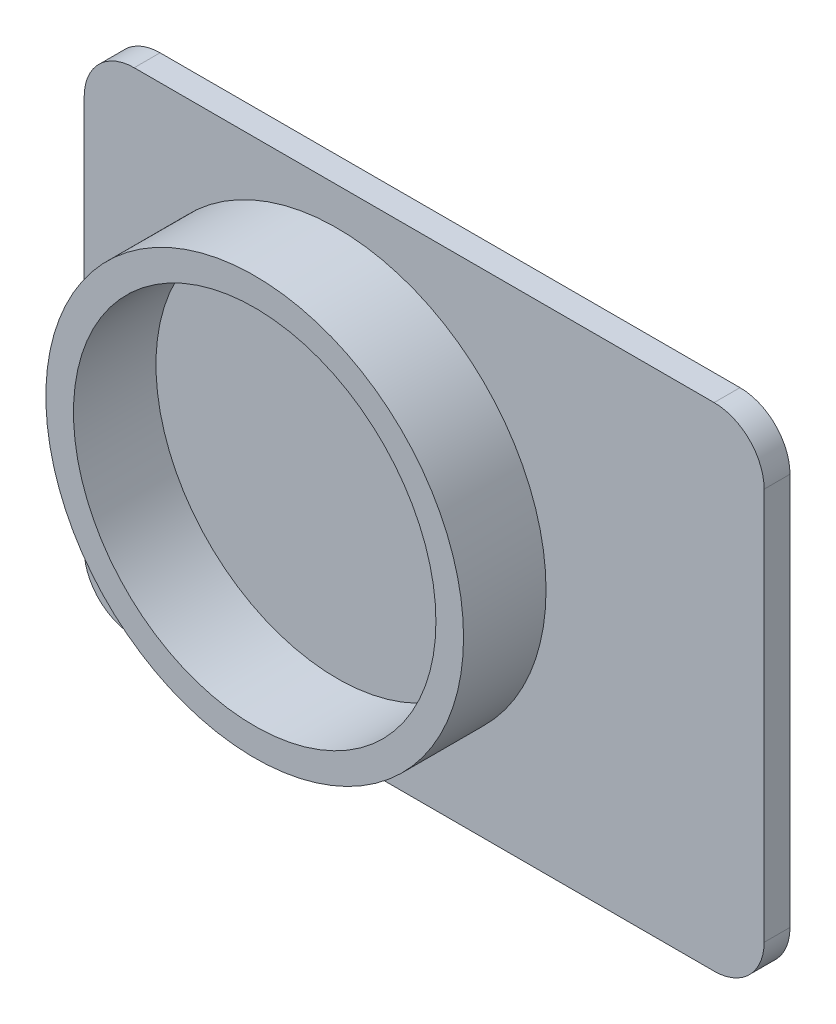
ISO-10303-21;
HEADER;
FILE_DESCRIPTION(('STEP AP214'),'2;1');
FILE_NAME('part.step','',(''),(''),'','','');
FILE_SCHEMA(('AUTOMOTIVE_DESIGN { 1 0 10303 214 1 1 1 1 }'));
ENDSEC;
DATA;
#1=APPLICATION_CONTEXT('core data for automotive mechanical design processes');
#2=APPLICATION_PROTOCOL_DEFINITION('international standard','automotive_design',2000,#1);
#3=PRODUCT_CONTEXT('',#1,'mechanical');
#4=PRODUCT('Part','Part','',(#3));
#5=PRODUCT_RELATED_PRODUCT_CATEGORY('part','',(#4));
#6=PRODUCT_DEFINITION_FORMATION('','',#4);
#7=PRODUCT_DEFINITION_CONTEXT('part definition',#1,'design');
#8=PRODUCT_DEFINITION('design','',#6,#7);
#9=PRODUCT_DEFINITION_SHAPE('','',#8);
#10=(LENGTH_UNIT() NAMED_UNIT(*) SI_UNIT(.MILLI.,.METRE.));
#11=(NAMED_UNIT(*) PLANE_ANGLE_UNIT() SI_UNIT($,.RADIAN.));
#12=(NAMED_UNIT(*) SI_UNIT($,.STERADIAN.) SOLID_ANGLE_UNIT());
#13=UNCERTAINTY_MEASURE_WITH_UNIT(LENGTH_MEASURE(1.E-05),#10,'distance_accuracy_value','');
#14=(GEOMETRIC_REPRESENTATION_CONTEXT(3) GLOBAL_UNCERTAINTY_ASSIGNED_CONTEXT((#13)) GLOBAL_UNIT_ASSIGNED_CONTEXT((#10,
#11,#12)) REPRESENTATION_CONTEXT('',''));
#15=CARTESIAN_POINT('',(0.,0.,0.));
#16=DIRECTION('',(0.,0.,1.));
#17=DIRECTION('',(1.,0.,0.));
#18=AXIS2_PLACEMENT_3D('',#15,#16,#17);
#19=CARTESIAN_POINT('',(-23.2,15.7,2.07));
#20=DIRECTION('',(0.,0.,-1.));
#21=DIRECTION('',(-1.,0.,0.));
#22=AXIS2_PLACEMENT_3D('',#19,#20,#21);
#23=CYLINDRICAL_SURFACE('',#22,4.00000000000001);
#24=CARTESIAN_POINT('',(-23.2,15.7,0.));
#25=DIRECTION('',(0.,0.,1.));
#26=DIRECTION('',(1.,0.,0.));
#27=AXIS2_PLACEMENT_3D('',#24,#25,#26);
#28=CIRCLE('',#27,4.00000000000001);
#29=CARTESIAN_POINT('',(-23.2,19.7,0.));
#30=VERTEX_POINT('',#29);
#31=CARTESIAN_POINT('',(-27.2,15.7,0.));
#32=VERTEX_POINT('',#31);
#33=EDGE_CURVE('E154',#30,#32,#28,.T.);
#34=ORIENTED_EDGE('',*,*,#33,.T.);
#35=DIRECTION('',(0.,0.,-1.));
#36=VECTOR('',#35,1.);
#37=CARTESIAN_POINT('',(-27.2,15.7,2.07));
#38=LINE('',#37,#36);
#39=CARTESIAN_POINT('',(-27.2,15.7,2.07));
#40=VERTEX_POINT('',#39);
#41=EDGE_CURVE('E52',#40,#32,#38,.T.);
#42=ORIENTED_EDGE('',*,*,#41,.F.);
#43=CARTESIAN_POINT('',(-23.2,15.7,2.07));
#44=DIRECTION('',(0.,0.,1.));
#45=DIRECTION('',(1.,0.,0.));
#46=AXIS2_PLACEMENT_3D('',#43,#44,#45);
#47=CIRCLE('',#46,4.00000000000001);
#48=CARTESIAN_POINT('',(-23.2,19.7,2.07));
#49=VERTEX_POINT('',#48);
#50=EDGE_CURVE('E177',#49,#40,#47,.T.);
#51=ORIENTED_EDGE('',*,*,#50,.F.);
#52=DIRECTION('',(0.,0.,-1.));
#53=VECTOR('',#52,1.);
#54=CARTESIAN_POINT('',(-23.2,19.7,2.07));
#55=LINE('',#54,#53);
#56=EDGE_CURVE('E150',#49,#30,#55,.T.);
#57=ORIENTED_EDGE('',*,*,#56,.T.);
#58=EDGE_LOOP('',(#34,#42,#51,#57));
#59=FACE_BOUND('',#58,.T.);
#60=ADVANCED_FACE('F49',(#59),#23,.T.);
#61=CARTESIAN_POINT('',(-27.2,-15.7,2.07));
#62=DIRECTION('',(1.,0.,0.));
#63=DIRECTION('',(0.,1.,0.));
#64=AXIS2_PLACEMENT_3D('',#61,#62,#63);
#65=PLANE('',#64);
#66=DIRECTION('',(0.,-1.,0.));
#67=VECTOR('',#66,1.);
#68=CARTESIAN_POINT('',(-27.2,-15.7,0.));
#69=LINE('',#68,#67);
#70=CARTESIAN_POINT('',(-27.2,-15.7,0.));
#71=VERTEX_POINT('',#70);
#72=EDGE_CURVE('E158',#32,#71,#69,.T.);
#73=ORIENTED_EDGE('',*,*,#72,.T.);
#74=DIRECTION('',(0.,0.,-1.));
#75=VECTOR('',#74,1.);
#76=CARTESIAN_POINT('',(-27.2,-15.7,2.07));
#77=LINE('',#76,#75);
#78=CARTESIAN_POINT('',(-27.2,-15.7,2.07));
#79=VERTEX_POINT('',#78);
#80=EDGE_CURVE('E191',#79,#71,#77,.T.);
#81=ORIENTED_EDGE('',*,*,#80,.F.);
#82=DIRECTION('',(0.,-1.,0.));
#83=VECTOR('',#82,1.);
#84=CARTESIAN_POINT('',(-27.2,-15.7,2.07));
#85=LINE('',#84,#83);
#86=EDGE_CURVE('E111',#40,#79,#85,.T.);
#87=ORIENTED_EDGE('',*,*,#86,.F.);
#88=ORIENTED_EDGE('',*,*,#41,.T.);
#89=EDGE_LOOP('',(#73,#81,#87,#88));
#90=FACE_BOUND('',#89,.T.);
#91=ADVANCED_FACE('F203',(#90),#65,.F.);
#92=CARTESIAN_POINT('',(-23.2,-15.7,2.07));
#93=DIRECTION('',(0.,0.,-1.));
#94=DIRECTION('',(-1.,0.,0.));
#95=AXIS2_PLACEMENT_3D('',#92,#93,#94);
#96=CYLINDRICAL_SURFACE('',#95,4.);
#97=CARTESIAN_POINT('',(-23.2,-15.7,0.));
#98=DIRECTION('',(0.,0.,1.));
#99=DIRECTION('',(1.,0.,0.));
#100=AXIS2_PLACEMENT_3D('',#97,#98,#99);
#101=CIRCLE('',#100,4.);
#102=CARTESIAN_POINT('',(-23.2,-19.7,0.));
#103=VERTEX_POINT('',#102);
#104=EDGE_CURVE('E162',#71,#103,#101,.T.);
#105=ORIENTED_EDGE('',*,*,#104,.T.);
#106=DIRECTION('',(0.,0.,-1.));
#107=VECTOR('',#106,1.);
#108=CARTESIAN_POINT('',(-23.2,-19.7,2.07));
#109=LINE('',#108,#107);
#110=CARTESIAN_POINT('',(-23.2,-19.7,2.07));
#111=VERTEX_POINT('',#110);
#112=EDGE_CURVE('E188',#111,#103,#109,.T.);
#113=ORIENTED_EDGE('',*,*,#112,.F.);
#114=CARTESIAN_POINT('',(-23.2,-15.7,2.07));
#115=DIRECTION('',(0.,0.,1.));
#116=DIRECTION('',(1.,0.,0.));
#117=AXIS2_PLACEMENT_3D('',#114,#115,#116);
#118=CIRCLE('',#117,4.);
#119=EDGE_CURVE('E219',#79,#111,#118,.T.);
#120=ORIENTED_EDGE('',*,*,#119,.F.);
#121=ORIENTED_EDGE('',*,*,#80,.T.);
#122=EDGE_LOOP('',(#105,#113,#120,#121));
#123=FACE_BOUND('',#122,.T.);
#124=ADVANCED_FACE('F212',(#123),#96,.T.);
#125=CARTESIAN_POINT('',(23.2,-19.7,2.07));
#126=DIRECTION('',(0.,1.,0.));
#127=DIRECTION('',(-1.,0.,0.));
#128=AXIS2_PLACEMENT_3D('',#125,#126,#127);
#129=PLANE('',#128);
#130=DIRECTION('',(1.,0.,0.));
#131=VECTOR('',#130,1.);
#132=CARTESIAN_POINT('',(23.2,-19.7,0.));
#133=LINE('',#132,#131);
#134=CARTESIAN_POINT('',(23.2,-19.7,0.));
#135=VERTEX_POINT('',#134);
#136=EDGE_CURVE('E165',#103,#135,#133,.T.);
#137=ORIENTED_EDGE('',*,*,#136,.T.);
#138=DIRECTION('',(0.,0.,-1.));
#139=VECTOR('',#138,1.);
#140=CARTESIAN_POINT('',(23.2,-19.7,2.07));
#141=LINE('',#140,#139);
#142=CARTESIAN_POINT('',(23.2,-19.7,2.07));
#143=VERTEX_POINT('',#142);
#144=EDGE_CURVE('E184',#143,#135,#141,.T.);
#145=ORIENTED_EDGE('',*,*,#144,.F.);
#146=DIRECTION('',(1.,0.,0.));
#147=VECTOR('',#146,1.);
#148=CARTESIAN_POINT('',(23.2,-19.7,2.07));
#149=LINE('',#148,#147);
#150=EDGE_CURVE('E217',#111,#143,#149,.T.);
#151=ORIENTED_EDGE('',*,*,#150,.F.);
#152=ORIENTED_EDGE('',*,*,#112,.T.);
#153=EDGE_LOOP('',(#137,#145,#151,#152));
#154=FACE_BOUND('',#153,.T.);
#155=ADVANCED_FACE('F215',(#154),#129,.F.);
#156=CARTESIAN_POINT('',(23.2,-15.7,2.07));
#157=DIRECTION('',(0.,0.,-1.));
#158=DIRECTION('',(-1.,0.,0.));
#159=AXIS2_PLACEMENT_3D('',#156,#157,#158);
#160=CYLINDRICAL_SURFACE('',#159,4.);
#161=CARTESIAN_POINT('',(23.2,-15.7,0.));
#162=DIRECTION('',(0.,0.,1.));
#163=DIRECTION('',(1.,0.,0.));
#164=AXIS2_PLACEMENT_3D('',#161,#162,#163);
#165=CIRCLE('',#164,4.);
#166=CARTESIAN_POINT('',(27.2,-15.7,0.));
#167=VERTEX_POINT('',#166);
#168=EDGE_CURVE('E168',#135,#167,#165,.T.);
#169=ORIENTED_EDGE('',*,*,#168,.T.);
#170=DIRECTION('',(0.,0.,-1.));
#171=VECTOR('',#170,1.);
#172=CARTESIAN_POINT('',(27.2,-15.7,2.07));
#173=LINE('',#172,#171);
#174=CARTESIAN_POINT('',(27.2,-15.7,2.07));
#175=VERTEX_POINT('',#174);
#176=EDGE_CURVE('E141',#175,#167,#173,.T.);
#177=ORIENTED_EDGE('',*,*,#176,.F.);
#178=CARTESIAN_POINT('',(23.2,-15.7,2.07));
#179=DIRECTION('',(0.,0.,1.));
#180=DIRECTION('',(1.,0.,0.));
#181=AXIS2_PLACEMENT_3D('',#178,#179,#180);
#182=CIRCLE('',#181,4.);
#183=EDGE_CURVE('E130',#143,#175,#182,.T.);
#184=ORIENTED_EDGE('',*,*,#183,.F.);
#185=ORIENTED_EDGE('',*,*,#144,.T.);
#186=EDGE_LOOP('',(#169,#177,#184,#185));
#187=FACE_BOUND('',#186,.T.);
#188=ADVANCED_FACE('F271',(#187),#160,.T.);
#189=CARTESIAN_POINT('',(27.2,-15.7,2.07));
#190=DIRECTION('',(-1.,0.,0.));
#191=DIRECTION('',(0.,0.,1.));
#192=AXIS2_PLACEMENT_3D('',#189,#190,#191);
#193=PLANE('',#192);
#194=DIRECTION('',(0.,1.,0.));
#195=VECTOR('',#194,1.);
#196=CARTESIAN_POINT('',(27.2,-15.7,0.));
#197=LINE('',#196,#195);
#198=CARTESIAN_POINT('',(27.2,15.7,0.));
#199=VERTEX_POINT('',#198);
#200=EDGE_CURVE('E139',#167,#199,#197,.T.);
#201=ORIENTED_EDGE('',*,*,#200,.T.);
#202=DIRECTION('',(0.,0.,-1.));
#203=VECTOR('',#202,1.);
#204=CARTESIAN_POINT('',(27.2,15.7,2.07));
#205=LINE('',#204,#203);
#206=CARTESIAN_POINT('',(27.2,15.7,2.07));
#207=VERTEX_POINT('',#206);
#208=EDGE_CURVE('E136',#207,#199,#205,.T.);
#209=ORIENTED_EDGE('',*,*,#208,.F.);
#210=DIRECTION('',(0.,1.,0.));
#211=VECTOR('',#210,1.);
#212=CARTESIAN_POINT('',(27.2,-15.7,2.07));
#213=LINE('',#212,#211);
#214=EDGE_CURVE('E124',#175,#207,#213,.T.);
#215=ORIENTED_EDGE('',*,*,#214,.F.);
#216=ORIENTED_EDGE('',*,*,#176,.T.);
#217=EDGE_LOOP('',(#201,#209,#215,#216));
#218=FACE_BOUND('',#217,.T.);
#219=ADVANCED_FACE('F137',(#218),#193,.F.);
#220=CARTESIAN_POINT('',(23.2,15.7,2.07));
#221=DIRECTION('',(0.,0.,-1.));
#222=DIRECTION('',(-1.,0.,0.));
#223=AXIS2_PLACEMENT_3D('',#220,#221,#222);
#224=CYLINDRICAL_SURFACE('',#223,4.);
#225=CARTESIAN_POINT('',(23.2,15.7,0.));
#226=DIRECTION('',(0.,0.,1.));
#227=DIRECTION('',(1.,0.,0.));
#228=AXIS2_PLACEMENT_3D('',#225,#226,#227);
#229=CIRCLE('',#228,4.);
#230=CARTESIAN_POINT('',(23.2,19.7,0.));
#231=VERTEX_POINT('',#230);
#232=EDGE_CURVE('E96',#199,#231,#229,.T.);
#233=ORIENTED_EDGE('',*,*,#232,.T.);
#234=DIRECTION('',(0.,0.,-1.));
#235=VECTOR('',#234,1.);
#236=CARTESIAN_POINT('',(23.2,19.7,2.07));
#237=LINE('',#236,#235);
#238=CARTESIAN_POINT('',(23.2,19.7,2.07));
#239=VERTEX_POINT('',#238);
#240=EDGE_CURVE('E142',#239,#231,#237,.T.);
#241=ORIENTED_EDGE('',*,*,#240,.F.);
#242=CARTESIAN_POINT('',(23.2,15.7,2.07));
#243=DIRECTION('',(0.,0.,1.));
#244=DIRECTION('',(1.,0.,0.));
#245=AXIS2_PLACEMENT_3D('',#242,#243,#244);
#246=CIRCLE('',#245,4.);
#247=EDGE_CURVE('E128',#207,#239,#246,.T.);
#248=ORIENTED_EDGE('',*,*,#247,.F.);
#249=ORIENTED_EDGE('',*,*,#208,.T.);
#250=EDGE_LOOP('',(#233,#241,#248,#249));
#251=FACE_BOUND('',#250,.T.);
#252=ADVANCED_FACE('F144',(#251),#224,.T.);
#253=CARTESIAN_POINT('',(23.2,19.7,2.07));
#254=DIRECTION('',(0.,-1.,0.));
#255=DIRECTION('',(1.,0.,0.));
#256=AXIS2_PLACEMENT_3D('',#253,#254,#255);
#257=PLANE('',#256);
#258=DIRECTION('',(-1.,0.,0.));
#259=VECTOR('',#258,1.);
#260=CARTESIAN_POINT('',(23.2,19.7,0.));
#261=LINE('',#260,#259);
#262=EDGE_CURVE('E102',#231,#30,#261,.T.);
#263=ORIENTED_EDGE('',*,*,#262,.T.);
#264=ORIENTED_EDGE('',*,*,#56,.F.);
#265=DIRECTION('',(-1.,0.,0.));
#266=VECTOR('',#265,1.);
#267=CARTESIAN_POINT('',(23.2,19.7,2.07));
#268=LINE('',#267,#266);
#269=EDGE_CURVE('E67',#239,#49,#268,.T.);
#270=ORIENTED_EDGE('',*,*,#269,.F.);
#271=ORIENTED_EDGE('',*,*,#240,.T.);
#272=EDGE_LOOP('',(#263,#264,#270,#271));
#273=FACE_BOUND('',#272,.T.);
#274=ADVANCED_FACE('F279',(#273),#257,.F.);
#275=CARTESIAN_POINT('',(-23.2,15.7,2.07));
#276=DIRECTION('',(0.,0.,1.));
#277=DIRECTION('',(1.,0.,0.));
#278=AXIS2_PLACEMENT_3D('',#275,#276,#277);
#279=PLANE('',#278);
#280=CARTESIAN_POINT('',(-6.95880818160018,0.,2.07));
#281=DIRECTION('',(0.,0.,1.));
#282=DIRECTION('',(1.,0.,0.));
#283=AXIS2_PLACEMENT_3D('',#280,#281,#282);
#284=CIRCLE('',#283,16.71);
#285=CARTESIAN_POINT('',(9.75119181839983,0.,2.07));
#286=VERTEX_POINT('',#285);
#287=EDGE_CURVE('E159',#286,#286,#284,.F.);
#288=ORIENTED_EDGE('',*,*,#287,.T.);
#289=EDGE_LOOP('',(#288));
#290=FACE_BOUND('',#289,.T.);
#291=ORIENTED_EDGE('',*,*,#50,.T.);
#292=ORIENTED_EDGE('',*,*,#86,.T.);
#293=ORIENTED_EDGE('',*,*,#119,.T.);
#294=ORIENTED_EDGE('',*,*,#150,.T.);
#295=ORIENTED_EDGE('',*,*,#183,.T.);
#296=ORIENTED_EDGE('',*,*,#214,.T.);
#297=ORIENTED_EDGE('',*,*,#247,.T.);
#298=ORIENTED_EDGE('',*,*,#269,.T.);
#299=EDGE_LOOP('',(#291,#292,#293,#294,#295,#296,#297,#298));
#300=FACE_BOUND('',#299,.T.);
#301=ADVANCED_FACE('F126',(#290,#300),#279,.T.);
#302=CARTESIAN_POINT('',(-23.2,15.7,0.));
#303=DIRECTION('',(0.,0.,1.));
#304=DIRECTION('',(1.,0.,0.));
#305=AXIS2_PLACEMENT_3D('',#302,#303,#304);
#306=PLANE('',#305);
#307=ORIENTED_EDGE('',*,*,#33,.F.);
#308=ORIENTED_EDGE('',*,*,#262,.F.);
#309=ORIENTED_EDGE('',*,*,#232,.F.);
#310=ORIENTED_EDGE('',*,*,#200,.F.);
#311=ORIENTED_EDGE('',*,*,#168,.F.);
#312=ORIENTED_EDGE('',*,*,#136,.F.);
#313=ORIENTED_EDGE('',*,*,#104,.F.);
#314=ORIENTED_EDGE('',*,*,#72,.F.);
#315=EDGE_LOOP('',(#307,#308,#309,#310,#311,#312,#313,#314));
#316=FACE_BOUND('',#315,.T.);
#317=ADVANCED_FACE('F208',(#316),#306,.F.);
#318=CARTESIAN_POINT('',(-6.95880818160018,0.,8.67));
#319=DIRECTION('',(0.,0.,1.));
#320=DIRECTION('',(1.,0.,0.));
#321=AXIS2_PLACEMENT_3D('',#318,#319,#320);
#322=PLANE('',#321);
#323=CARTESIAN_POINT('',(-6.95880818160018,0.,8.67));
#324=DIRECTION('',(0.,0.,1.));
#325=DIRECTION('',(1.,0.,0.));
#326=AXIS2_PLACEMENT_3D('',#323,#324,#325);
#327=CIRCLE('',#326,16.71);
#328=CARTESIAN_POINT('',(9.75119181839983,0.,8.67));
#329=VERTEX_POINT('',#328);
#330=EDGE_CURVE('E233',#329,#329,#327,.T.);
#331=ORIENTED_EDGE('',*,*,#330,.T.);
#332=EDGE_LOOP('',(#331));
#333=FACE_BOUND('',#332,.T.);
#334=CARTESIAN_POINT('',(-6.95880818160018,0.,8.67));
#335=DIRECTION('',(0.,0.,1.));
#336=DIRECTION('',(1.,0.,0.));
#337=AXIS2_PLACEMENT_3D('',#334,#335,#336);
#338=CIRCLE('',#337,14.5);
#339=CARTESIAN_POINT('',(7.54119181839982,0.,8.67));
#340=VERTEX_POINT('',#339);
#341=EDGE_CURVE('E238',#340,#340,#338,.T.);
#342=ORIENTED_EDGE('',*,*,#341,.F.);
#343=EDGE_LOOP('',(#342));
#344=FACE_BOUND('',#343,.T.);
#345=ADVANCED_FACE('F247',(#333,#344),#322,.T.);
#346=CARTESIAN_POINT('',(-6.95880818160018,0.,8.67));
#347=DIRECTION('',(0.,0.,-1.));
#348=DIRECTION('',(-1.,0.,0.));
#349=AXIS2_PLACEMENT_3D('',#346,#347,#348);
#350=CYLINDRICAL_SURFACE('',#349,16.71);
#351=ORIENTED_EDGE('',*,*,#287,.F.);
#352=EDGE_LOOP('',(#351));
#353=FACE_BOUND('',#352,.T.);
#354=ORIENTED_EDGE('',*,*,#330,.F.);
#355=EDGE_LOOP('',(#354));
#356=FACE_BOUND('',#355,.T.);
#357=ADVANCED_FACE('F249',(#353,#356),#350,.T.);
#358=CARTESIAN_POINT('',(-6.95880818160018,0.,8.67));
#359=DIRECTION('',(0.,0.,-1.));
#360=DIRECTION('',(-1.,0.,0.));
#361=AXIS2_PLACEMENT_3D('',#358,#359,#360);
#362=CYLINDRICAL_SURFACE('',#361,14.5);
#363=CARTESIAN_POINT('',(-6.95880818160018,0.,2.07));
#364=DIRECTION('',(0.,0.,1.));
#365=DIRECTION('',(1.,0.,0.));
#366=AXIS2_PLACEMENT_3D('',#363,#364,#365);
#367=CIRCLE('',#366,14.5);
#368=CARTESIAN_POINT('',(7.54119181839982,0.,2.07));
#369=VERTEX_POINT('',#368);
#370=EDGE_CURVE('E12',#369,#369,#367,.F.);
#371=ORIENTED_EDGE('',*,*,#370,.T.);
#372=EDGE_LOOP('',(#371));
#373=FACE_BOUND('',#372,.T.);
#374=ORIENTED_EDGE('',*,*,#341,.T.);
#375=EDGE_LOOP('',(#374));
#376=FACE_BOUND('',#375,.T.);
#377=ADVANCED_FACE('F245',(#373,#376),#362,.F.);
#378=ORIENTED_EDGE('',*,*,#370,.F.);
#379=EDGE_LOOP('',(#378));
#380=FACE_BOUND('',#379,.T.);
#381=ADVANCED_FACE('F284',(#380),#279,.T.);
#382=CLOSED_SHELL('',(#60,#91,#124,#155,#188,#219,#252,#274,#301,#317,#345,#357,#377,#381));
#383=MANIFOLD_SOLID_BREP('B2',#382);
#384=ADVANCED_BREP_SHAPE_REPRESENTATION('',(#18,#383),#14);
#385=SHAPE_DEFINITION_REPRESENTATION(#9,#384);
ENDSEC;
END-ISO-10303-21;
